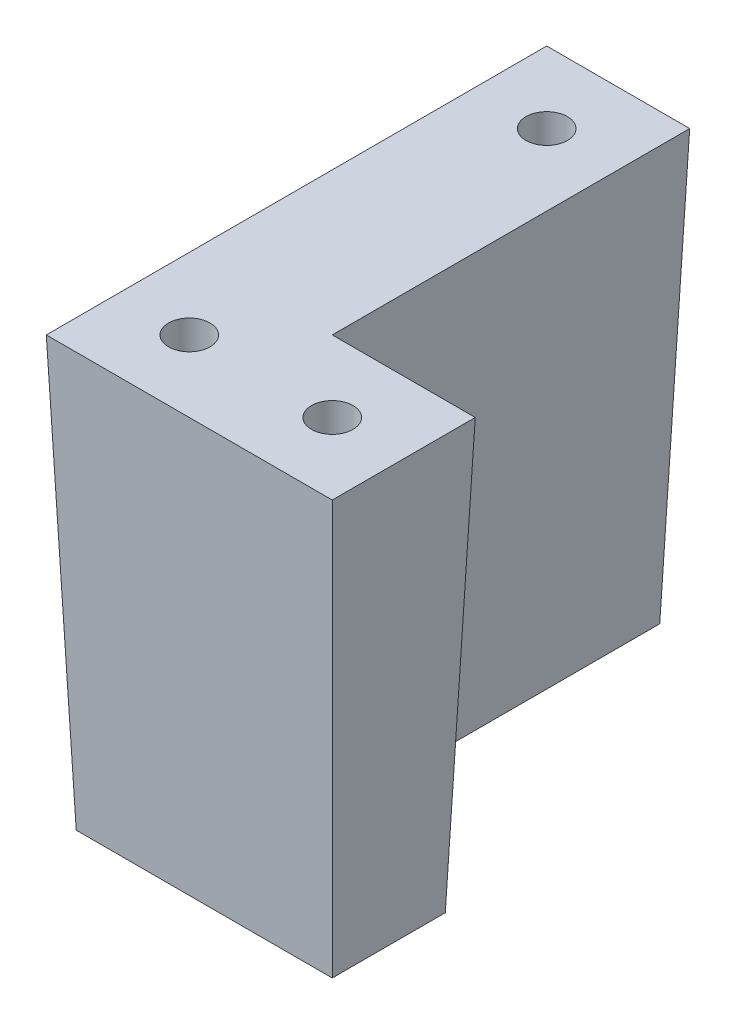
ISO-10303-21;
HEADER;
FILE_DESCRIPTION(('STEP AP214'),'2;1');
FILE_NAME('part.step','',(''),(''),'','','');
FILE_SCHEMA(('AUTOMOTIVE_DESIGN { 1 0 10303 214 1 1 1 1 }'));
ENDSEC;
DATA;
#1=APPLICATION_CONTEXT('core data for automotive mechanical design processes');
#2=APPLICATION_PROTOCOL_DEFINITION('international standard','automotive_design',2000,#1);
#3=PRODUCT_CONTEXT('',#1,'mechanical');
#4=PRODUCT('Part','Part','',(#3));
#5=PRODUCT_RELATED_PRODUCT_CATEGORY('part','',(#4));
#6=PRODUCT_DEFINITION_FORMATION('','',#4);
#7=PRODUCT_DEFINITION_CONTEXT('part definition',#1,'design');
#8=PRODUCT_DEFINITION('design','',#6,#7);
#9=PRODUCT_DEFINITION_SHAPE('','',#8);
#10=(LENGTH_UNIT() NAMED_UNIT(*) SI_UNIT(.MILLI.,.METRE.));
#11=(NAMED_UNIT(*) PLANE_ANGLE_UNIT() SI_UNIT($,.RADIAN.));
#12=(NAMED_UNIT(*) SI_UNIT($,.STERADIAN.) SOLID_ANGLE_UNIT());
#13=UNCERTAINTY_MEASURE_WITH_UNIT(LENGTH_MEASURE(1.E-05),#10,'distance_accuracy_value','');
#14=(GEOMETRIC_REPRESENTATION_CONTEXT(3) GLOBAL_UNCERTAINTY_ASSIGNED_CONTEXT((#13)) GLOBAL_UNIT_ASSIGNED_CONTEXT((#10,
#11,#12)) REPRESENTATION_CONTEXT('',''));
#15=CARTESIAN_POINT('',(0.,0.,0.));
#16=DIRECTION('',(0.,0.,1.));
#17=DIRECTION('',(1.,0.,0.));
#18=AXIS2_PLACEMENT_3D('',#15,#16,#17);
#19=CARTESIAN_POINT('',(0.,0.,0.));
#20=DIRECTION('',(-0.999390827019096,-0.034899496702501,0.));
#21=DIRECTION('',(0.034899496702501,-0.999390827019096,0.));
#22=AXIS2_PLACEMENT_3D('',#19,#20,#21);
#23=PLANE('',#22);
#24=DIRECTION('',(0.,0.,1.));
#25=VECTOR('',#24,1.);
#26=CARTESIAN_POINT('',(0.,0.,0.));
#27=LINE('',#26,#25);
#28=CARTESIAN_POINT('',(0.,0.,-70.));
#29=VERTEX_POINT('',#28);
#30=CARTESIAN_POINT('',(0.,0.,0.));
#31=VERTEX_POINT('',#30);
#32=EDGE_CURVE('E121',#29,#31,#27,.T.);
#33=ORIENTED_EDGE('',*,*,#32,.F.);
#34=DIRECTION('',(-0.0348782627423747,0.998782765958718,-0.0348782627423747));
#35=VECTOR('',#34,1.);
#36=CARTESIAN_POINT('',(0.,0.,-70.));
#37=LINE('',#36,#35);
#38=CARTESIAN_POINT('',(2.09524616950487,-60.,-67.9047538304951));
#39=VERTEX_POINT('',#38);
#40=EDGE_CURVE('E11',#39,#29,#37,.T.);
#41=ORIENTED_EDGE('',*,*,#40,.F.);
#42=DIRECTION('',(0.,0.,1.));
#43=VECTOR('',#42,1.);
#44=CARTESIAN_POINT('',(2.09524616950487,-60.,0.));
#45=LINE('',#44,#43);
#46=CARTESIAN_POINT('',(2.09524616950487,-60.,-2.09524616950487));
#47=VERTEX_POINT('',#46);
#48=EDGE_CURVE('E123',#39,#47,#45,.T.);
#49=ORIENTED_EDGE('',*,*,#48,.T.);
#50=DIRECTION('',(-0.0348782627423747,0.998782765958718,0.0348782627423747));
#51=VECTOR('',#50,1.);
#52=CARTESIAN_POINT('',(0.,0.,0.));
#53=LINE('',#52,#51);
#54=EDGE_CURVE('E94',#47,#31,#53,.T.);
#55=ORIENTED_EDGE('',*,*,#54,.T.);
#56=EDGE_LOOP('',(#33,#41,#49,#55));
#57=FACE_BOUND('',#56,.T.);
#58=ADVANCED_FACE('F43',(#57),#23,.T.);
#59=CARTESIAN_POINT('',(0.,0.,-70.));
#60=DIRECTION('',(0.,-0.034899496702501,-0.999390827019096));
#61=DIRECTION('',(0.,0.999390827019096,-0.034899496702501));
#62=AXIS2_PLACEMENT_3D('',#59,#60,#61);
#63=PLANE('',#62);
#64=DIRECTION('',(-1.,0.,0.));
#65=VECTOR('',#64,1.);
#66=CARTESIAN_POINT('',(0.,0.,-70.));
#67=LINE('',#66,#65);
#68=CARTESIAN_POINT('',(20.,0.,-70.));
#69=VERTEX_POINT('',#68);
#70=EDGE_CURVE('E136',#69,#29,#67,.T.);
#71=ORIENTED_EDGE('',*,*,#70,.F.);
#72=DIRECTION('',(0.0348782627423747,0.998782765958718,-0.0348782627423747));
#73=VECTOR('',#72,1.);
#74=CARTESIAN_POINT('',(20.,0.,-70.));
#75=LINE('',#74,#73);
#76=CARTESIAN_POINT('',(17.9047538304951,-60.,-67.9047538304951));
#77=VERTEX_POINT('',#76);
#78=EDGE_CURVE('E54',#77,#69,#75,.T.);
#79=ORIENTED_EDGE('',*,*,#78,.F.);
#80=DIRECTION('',(-1.,0.,0.));
#81=VECTOR('',#80,1.);
#82=CARTESIAN_POINT('',(0.,-60.,-67.9047538304951));
#83=LINE('',#82,#81);
#84=EDGE_CURVE('E125',#77,#39,#83,.T.);
#85=ORIENTED_EDGE('',*,*,#84,.T.);
#86=ORIENTED_EDGE('',*,*,#40,.T.);
#87=EDGE_LOOP('',(#71,#79,#85,#86));
#88=FACE_BOUND('',#87,.T.);
#89=ADVANCED_FACE('F45',(#88),#63,.T.);
#90=CARTESIAN_POINT('',(20.,0.,-70.));
#91=DIRECTION('',(0.999390827019096,-0.034899496702501,0.));
#92=DIRECTION('',(0.034899496702501,0.999390827019096,0.));
#93=AXIS2_PLACEMENT_3D('',#90,#91,#92);
#94=PLANE('',#93);
#95=DIRECTION('',(0.,0.,-1.));
#96=VECTOR('',#95,1.);
#97=CARTESIAN_POINT('',(20.,0.,-70.));
#98=LINE('',#97,#96);
#99=CARTESIAN_POINT('',(20.,0.,-20.));
#100=VERTEX_POINT('',#99);
#101=EDGE_CURVE('E152',#100,#69,#98,.T.);
#102=ORIENTED_EDGE('',*,*,#101,.F.);
#103=DIRECTION('',(0.0348782627423747,0.998782765958718,-0.0348782627423747));
#104=VECTOR('',#103,1.);
#105=CARTESIAN_POINT('',(20.0608246605963,1.7417903866832,-20.0608246605963));
#106=LINE('',#105,#104);
#107=CARTESIAN_POINT('',(17.9047538304951,-60.,-17.9047538304951));
#108=VERTEX_POINT('',#107);
#109=EDGE_CURVE('E162',#108,#100,#106,.T.);
#110=ORIENTED_EDGE('',*,*,#109,.F.);
#111=DIRECTION('',(0.,0.,-1.));
#112=VECTOR('',#111,1.);
#113=CARTESIAN_POINT('',(17.9047538304951,-60.,-70.));
#114=LINE('',#113,#112);
#115=EDGE_CURVE('E171',#108,#77,#114,.T.);
#116=ORIENTED_EDGE('',*,*,#115,.T.);
#117=ORIENTED_EDGE('',*,*,#78,.T.);
#118=EDGE_LOOP('',(#102,#110,#116,#117));
#119=FACE_BOUND('',#118,.T.);
#120=ADVANCED_FACE('F189',(#119),#94,.T.);
#121=CARTESIAN_POINT('',(40.,0.,-20.));
#122=DIRECTION('',(0.,-0.034899496702501,-0.999390827019096));
#123=DIRECTION('',(0.,0.999390827019096,-0.034899496702501));
#124=AXIS2_PLACEMENT_3D('',#121,#122,#123);
#125=PLANE('',#124);
#126=DIRECTION('',(-1.,0.,0.));
#127=VECTOR('',#126,1.);
#128=CARTESIAN_POINT('',(40.,0.,-20.));
#129=LINE('',#128,#127);
#130=CARTESIAN_POINT('',(40.,0.,-20.));
#131=VERTEX_POINT('',#130);
#132=EDGE_CURVE('E148',#131,#100,#129,.T.);
#133=ORIENTED_EDGE('',*,*,#132,.F.);
#134=DIRECTION('',(0.0348782627423747,0.998782765958718,-0.0348782627423747));
#135=VECTOR('',#134,1.);
#136=CARTESIAN_POINT('',(39.9756701357615,-0.696716154673278,-19.9756701357615));
#137=LINE('',#136,#135);
#138=CARTESIAN_POINT('',(37.9047538304951,-60.,-17.9047538304951));
#139=VERTEX_POINT('',#138);
#140=EDGE_CURVE('E159',#139,#131,#137,.T.);
#141=ORIENTED_EDGE('',*,*,#140,.F.);
#142=DIRECTION('',(-1.,0.,0.));
#143=VECTOR('',#142,1.);
#144=CARTESIAN_POINT('',(40.,-60.,-17.9047538304951));
#145=LINE('',#144,#143);
#146=EDGE_CURVE('E174',#139,#108,#145,.T.);
#147=ORIENTED_EDGE('',*,*,#146,.T.);
#148=ORIENTED_EDGE('',*,*,#109,.T.);
#149=EDGE_LOOP('',(#133,#141,#147,#148));
#150=FACE_BOUND('',#149,.T.);
#151=ADVANCED_FACE('F187',(#150),#125,.T.);
#152=CARTESIAN_POINT('',(40.,0.,0.));
#153=DIRECTION('',(0.999390827019096,-0.034899496702501,0.));
#154=DIRECTION('',(0.034899496702501,0.999390827019096,0.));
#155=AXIS2_PLACEMENT_3D('',#152,#153,#154);
#156=PLANE('',#155);
#157=DIRECTION('',(0.,0.,-1.));
#158=VECTOR('',#157,1.);
#159=CARTESIAN_POINT('',(40.,0.,0.));
#160=LINE('',#159,#158);
#161=CARTESIAN_POINT('',(40.,0.,0.));
#162=VERTEX_POINT('',#161);
#163=EDGE_CURVE('E133',#162,#131,#160,.T.);
#164=ORIENTED_EDGE('',*,*,#163,.F.);
#165=DIRECTION('',(0.0348782627423746,0.998782765958718,0.0348782627423747));
#166=VECTOR('',#165,1.);
#167=CARTESIAN_POINT('',(39.951340271523,-1.39343230934655,-0.0486597284770448));
#168=LINE('',#167,#166);
#169=CARTESIAN_POINT('',(37.9047538304951,-60.,-2.09524616950487));
#170=VERTEX_POINT('',#169);
#171=EDGE_CURVE('E86',#170,#162,#168,.T.);
#172=ORIENTED_EDGE('',*,*,#171,.F.);
#173=DIRECTION('',(0.,0.,-1.));
#174=VECTOR('',#173,1.);
#175=CARTESIAN_POINT('',(37.9047538304951,-60.,0.));
#176=LINE('',#175,#174);
#177=EDGE_CURVE('E177',#170,#139,#176,.T.);
#178=ORIENTED_EDGE('',*,*,#177,.T.);
#179=ORIENTED_EDGE('',*,*,#140,.T.);
#180=EDGE_LOOP('',(#164,#172,#178,#179));
#181=FACE_BOUND('',#180,.T.);
#182=ADVANCED_FACE('F188',(#181),#156,.T.);
#183=CARTESIAN_POINT('',(0.,0.,0.));
#184=DIRECTION('',(0.,-0.034899496702501,0.999390827019096));
#185=DIRECTION('',(0.,-0.999390827019096,-0.034899496702501));
#186=AXIS2_PLACEMENT_3D('',#183,#184,#185);
#187=PLANE('',#186);
#188=DIRECTION('',(1.,0.,0.));
#189=VECTOR('',#188,1.);
#190=CARTESIAN_POINT('',(0.,0.,0.));
#191=LINE('',#190,#189);
#192=EDGE_CURVE('E128',#31,#162,#191,.T.);
#193=ORIENTED_EDGE('',*,*,#192,.F.);
#194=ORIENTED_EDGE('',*,*,#54,.F.);
#195=DIRECTION('',(1.,0.,0.));
#196=VECTOR('',#195,1.);
#197=CARTESIAN_POINT('',(0.,-60.,-2.09524616950487));
#198=LINE('',#197,#196);
#199=EDGE_CURVE('E47',#47,#170,#198,.T.);
#200=ORIENTED_EDGE('',*,*,#199,.T.);
#201=ORIENTED_EDGE('',*,*,#171,.T.);
#202=EDGE_LOOP('',(#193,#194,#200,#201));
#203=FACE_BOUND('',#202,.T.);
#204=ADVANCED_FACE('F129',(#203),#187,.T.);
#205=CARTESIAN_POINT('',(0.,-60.,0.));
#206=DIRECTION('',(0.,-1.,0.));
#207=DIRECTION('',(0.,0.,-1.));
#208=AXIS2_PLACEMENT_3D('',#205,#206,#207);
#209=PLANE('',#208);
#210=CARTESIAN_POINT('',(30.,-60.,-9.99999999996308));
#211=DIRECTION('',(0.,-1.,0.));
#212=DIRECTION('',(0.,0.,-1.));
#213=AXIS2_PLACEMENT_3D('',#210,#211,#212);
#214=CIRCLE('',#213,5.74999999999999);
#215=CARTESIAN_POINT('',(30.,-60.,-15.7499999999631));
#216=VERTEX_POINT('',#215);
#217=EDGE_CURVE('E361',#216,#216,#214,.T.);
#218=ORIENTED_EDGE('',*,*,#217,.F.);
#219=EDGE_LOOP('',(#218));
#220=FACE_BOUND('',#219,.T.);
#221=CARTESIAN_POINT('',(9.99999999999091,-60.,-10.));
#222=DIRECTION('',(0.,-1.,0.));
#223=DIRECTION('',(0.,0.,-1.));
#224=AXIS2_PLACEMENT_3D('',#221,#222,#223);
#225=CIRCLE('',#224,5.74999999999999);
#226=CARTESIAN_POINT('',(9.99999999999091,-60.,-15.75));
#227=VERTEX_POINT('',#226);
#228=EDGE_CURVE('E375',#227,#227,#225,.T.);
#229=ORIENTED_EDGE('',*,*,#228,.F.);
#230=EDGE_LOOP('',(#229));
#231=FACE_BOUND('',#230,.T.);
#232=CARTESIAN_POINT('',(10.0000000007017,-60.,-60.));
#233=DIRECTION('',(0.,-1.,0.));
#234=DIRECTION('',(0.,0.,-1.));
#235=AXIS2_PLACEMENT_3D('',#232,#233,#234);
#236=CIRCLE('',#235,5.74999999999999);
#237=CARTESIAN_POINT('',(10.0000000007017,-60.,-65.75));
#238=VERTEX_POINT('',#237);
#239=EDGE_CURVE('E391',#238,#238,#236,.T.);
#240=ORIENTED_EDGE('',*,*,#239,.F.);
#241=EDGE_LOOP('',(#240));
#242=FACE_BOUND('',#241,.T.);
#243=ORIENTED_EDGE('',*,*,#48,.F.);
#244=ORIENTED_EDGE('',*,*,#84,.F.);
#245=ORIENTED_EDGE('',*,*,#115,.F.);
#246=ORIENTED_EDGE('',*,*,#146,.F.);
#247=ORIENTED_EDGE('',*,*,#177,.F.);
#248=ORIENTED_EDGE('',*,*,#199,.F.);
#249=EDGE_LOOP('',(#243,#244,#245,#246,#247,#248));
#250=FACE_BOUND('',#249,.T.);
#251=ADVANCED_FACE('F181',(#220,#231,#242,#250),#209,.T.);
#252=CARTESIAN_POINT('',(0.,0.,0.));
#253=DIRECTION('',(0.,-1.,0.));
#254=DIRECTION('',(0.,0.,-1.));
#255=AXIS2_PLACEMENT_3D('',#252,#253,#254);
#256=PLANE('',#255);
#257=CARTESIAN_POINT('',(30.,0.,-9.99999999996308));
#258=DIRECTION('',(0.,-1.,0.));
#259=DIRECTION('',(0.,0.,-1.));
#260=AXIS2_PLACEMENT_3D('',#257,#258,#259);
#261=CIRCLE('',#260,2.89999999999998);
#262=CARTESIAN_POINT('',(30.,0.,-12.8999999999631));
#263=VERTEX_POINT('',#262);
#264=EDGE_CURVE('E371',#263,#263,#261,.T.);
#265=ORIENTED_EDGE('',*,*,#264,.T.);
#266=EDGE_LOOP('',(#265));
#267=FACE_BOUND('',#266,.T.);
#268=CARTESIAN_POINT('',(9.99999999999091,0.,-10.));
#269=DIRECTION('',(0.,-1.,0.));
#270=DIRECTION('',(0.,0.,-1.));
#271=AXIS2_PLACEMENT_3D('',#268,#269,#270);
#272=CIRCLE('',#271,2.89999999999998);
#273=CARTESIAN_POINT('',(9.99999999999091,0.,-12.9));
#274=VERTEX_POINT('',#273);
#275=EDGE_CURVE('E387',#274,#274,#272,.T.);
#276=ORIENTED_EDGE('',*,*,#275,.T.);
#277=EDGE_LOOP('',(#276));
#278=FACE_BOUND('',#277,.T.);
#279=CARTESIAN_POINT('',(10.0000000007017,0.,-60.));
#280=DIRECTION('',(0.,-1.,0.));
#281=DIRECTION('',(0.,0.,-1.));
#282=AXIS2_PLACEMENT_3D('',#279,#280,#281);
#283=CIRCLE('',#282,2.89999999999998);
#284=CARTESIAN_POINT('',(10.0000000007017,0.,-62.9));
#285=VERTEX_POINT('',#284);
#286=EDGE_CURVE('E138',#285,#285,#283,.T.);
#287=ORIENTED_EDGE('',*,*,#286,.T.);
#288=EDGE_LOOP('',(#287));
#289=FACE_BOUND('',#288,.T.);
#290=ORIENTED_EDGE('',*,*,#32,.T.);
#291=ORIENTED_EDGE('',*,*,#192,.T.);
#292=ORIENTED_EDGE('',*,*,#163,.T.);
#293=ORIENTED_EDGE('',*,*,#132,.T.);
#294=ORIENTED_EDGE('',*,*,#101,.T.);
#295=ORIENTED_EDGE('',*,*,#70,.T.);
#296=EDGE_LOOP('',(#290,#291,#292,#293,#294,#295));
#297=FACE_BOUND('',#296,.T.);
#298=ADVANCED_FACE('F135',(#267,#278,#289,#297),#256,.F.);
#299=CARTESIAN_POINT('',(10.0000000007017,-60.,-60.));
#300=DIRECTION('',(0.,-1.,0.));
#301=DIRECTION('',(0.,0.,-1.));
#302=AXIS2_PLACEMENT_3D('',#299,#300,#301);
#303=CYLINDRICAL_SURFACE('',#302,2.89999999999998);
#304=ORIENTED_EDGE('',*,*,#286,.F.);
#305=EDGE_LOOP('',(#304));
#306=FACE_BOUND('',#305,.T.);
#307=CARTESIAN_POINT('',(10.0000000007017,-4.99999999999999,-60.));
#308=DIRECTION('',(0.,-1.,0.));
#309=DIRECTION('',(0.,0.,-1.));
#310=AXIS2_PLACEMENT_3D('',#307,#308,#309);
#311=CIRCLE('',#310,2.89999999999999);
#312=CARTESIAN_POINT('',(10.0000000007017,-4.99999999999999,-62.9));
#313=VERTEX_POINT('',#312);
#314=EDGE_CURVE('E142',#313,#313,#311,.T.);
#315=ORIENTED_EDGE('',*,*,#314,.T.);
#316=EDGE_LOOP('',(#315));
#317=FACE_BOUND('',#316,.T.);
#318=ADVANCED_FACE('F224',(#306,#317),#303,.F.);
#319=CARTESIAN_POINT('',(12.9000000007017,-4.99999999999999,-60.));
#320=DIRECTION('',(0.,1.,0.));
#321=DIRECTION('',(0.,0.,1.));
#322=AXIS2_PLACEMENT_3D('',#319,#320,#321);
#323=PLANE('',#322);
#324=ORIENTED_EDGE('',*,*,#314,.F.);
#325=EDGE_LOOP('',(#324));
#326=FACE_BOUND('',#325,.T.);
#327=CARTESIAN_POINT('',(10.0000000007017,-5.,-60.));
#328=DIRECTION('',(0.,-1.,0.));
#329=DIRECTION('',(0.,0.,-1.));
#330=AXIS2_PLACEMENT_3D('',#327,#328,#329);
#331=CIRCLE('',#330,5.74999999999999);
#332=CARTESIAN_POINT('',(10.0000000007017,-5.,-65.75));
#333=VERTEX_POINT('',#332);
#334=EDGE_CURVE('E395',#333,#333,#331,.T.);
#335=ORIENTED_EDGE('',*,*,#334,.T.);
#336=EDGE_LOOP('',(#335));
#337=FACE_BOUND('',#336,.T.);
#338=ADVANCED_FACE('F231',(#326,#337),#323,.F.);
#339=CARTESIAN_POINT('',(10.0000000007017,-60.,-60.));
#340=DIRECTION('',(0.,-1.,0.));
#341=DIRECTION('',(0.,0.,-1.));
#342=AXIS2_PLACEMENT_3D('',#339,#340,#341);
#343=CYLINDRICAL_SURFACE('',#342,5.74999999999999);
#344=ORIENTED_EDGE('',*,*,#334,.F.);
#345=EDGE_LOOP('',(#344));
#346=FACE_BOUND('',#345,.T.);
#347=ORIENTED_EDGE('',*,*,#239,.T.);
#348=EDGE_LOOP('',(#347));
#349=FACE_BOUND('',#348,.T.);
#350=ADVANCED_FACE('F239',(#346,#349),#343,.F.);
#351=CARTESIAN_POINT('',(9.99999999999091,-60.,-10.));
#352=DIRECTION('',(0.,-1.,0.));
#353=DIRECTION('',(0.,0.,-1.));
#354=AXIS2_PLACEMENT_3D('',#351,#352,#353);
#355=CYLINDRICAL_SURFACE('',#354,2.89999999999998);
#356=ORIENTED_EDGE('',*,*,#275,.F.);
#357=EDGE_LOOP('',(#356));
#358=FACE_BOUND('',#357,.T.);
#359=CARTESIAN_POINT('',(9.99999999999091,-4.99999999999999,-10.));
#360=DIRECTION('',(0.,-1.,0.));
#361=DIRECTION('',(0.,0.,-1.));
#362=AXIS2_PLACEMENT_3D('',#359,#360,#361);
#363=CIRCLE('',#362,2.89999999999999);
#364=CARTESIAN_POINT('',(9.99999999999091,-4.99999999999999,-12.9));
#365=VERTEX_POINT('',#364);
#366=EDGE_CURVE('E383',#365,#365,#363,.T.);
#367=ORIENTED_EDGE('',*,*,#366,.T.);
#368=EDGE_LOOP('',(#367));
#369=FACE_BOUND('',#368,.T.);
#370=ADVANCED_FACE('F248',(#358,#369),#355,.F.);
#371=CARTESIAN_POINT('',(12.8999999999909,-4.99999999999999,-10.));
#372=DIRECTION('',(0.,1.,0.));
#373=DIRECTION('',(0.,0.,1.));
#374=AXIS2_PLACEMENT_3D('',#371,#372,#373);
#375=PLANE('',#374);
#376=ORIENTED_EDGE('',*,*,#366,.F.);
#377=EDGE_LOOP('',(#376));
#378=FACE_BOUND('',#377,.T.);
#379=CARTESIAN_POINT('',(9.99999999999091,-5.,-10.));
#380=DIRECTION('',(0.,-1.,0.));
#381=DIRECTION('',(0.,0.,-1.));
#382=AXIS2_PLACEMENT_3D('',#379,#380,#381);
#383=CIRCLE('',#382,5.74999999999998);
#384=CARTESIAN_POINT('',(9.99999999999091,-5.,-15.75));
#385=VERTEX_POINT('',#384);
#386=EDGE_CURVE('E379',#385,#385,#383,.T.);
#387=ORIENTED_EDGE('',*,*,#386,.T.);
#388=EDGE_LOOP('',(#387));
#389=FACE_BOUND('',#388,.T.);
#390=ADVANCED_FACE('F255',(#378,#389),#375,.F.);
#391=CARTESIAN_POINT('',(9.99999999999091,-60.,-10.));
#392=DIRECTION('',(0.,-1.,0.));
#393=DIRECTION('',(0.,0.,-1.));
#394=AXIS2_PLACEMENT_3D('',#391,#392,#393);
#395=CYLINDRICAL_SURFACE('',#394,5.74999999999999);
#396=ORIENTED_EDGE('',*,*,#386,.F.);
#397=EDGE_LOOP('',(#396));
#398=FACE_BOUND('',#397,.T.);
#399=ORIENTED_EDGE('',*,*,#228,.T.);
#400=EDGE_LOOP('',(#399));
#401=FACE_BOUND('',#400,.T.);
#402=ADVANCED_FACE('F263',(#398,#401),#395,.F.);
#403=CARTESIAN_POINT('',(30.,-60.,-9.99999999996308));
#404=DIRECTION('',(0.,-1.,0.));
#405=DIRECTION('',(0.,0.,-1.));
#406=AXIS2_PLACEMENT_3D('',#403,#404,#405);
#407=CYLINDRICAL_SURFACE('',#406,2.89999999999998);
#408=ORIENTED_EDGE('',*,*,#264,.F.);
#409=EDGE_LOOP('',(#408));
#410=FACE_BOUND('',#409,.T.);
#411=CARTESIAN_POINT('',(30.,-4.99999999999999,-9.99999999996308));
#412=DIRECTION('',(0.,-1.,0.));
#413=DIRECTION('',(0.,0.,-1.));
#414=AXIS2_PLACEMENT_3D('',#411,#412,#413);
#415=CIRCLE('',#414,2.89999999999999);
#416=CARTESIAN_POINT('',(30.,-4.99999999999999,-12.8999999999631));
#417=VERTEX_POINT('',#416);
#418=EDGE_CURVE('E365',#417,#417,#415,.T.);
#419=ORIENTED_EDGE('',*,*,#418,.T.);
#420=EDGE_LOOP('',(#419));
#421=FACE_BOUND('',#420,.T.);
#422=ADVANCED_FACE('F271',(#410,#421),#407,.F.);
#423=CARTESIAN_POINT('',(32.9,-4.99999999999999,-9.99999999996308));
#424=DIRECTION('',(0.,1.,0.));
#425=DIRECTION('',(0.,0.,1.));
#426=AXIS2_PLACEMENT_3D('',#423,#424,#425);
#427=PLANE('',#426);
#428=ORIENTED_EDGE('',*,*,#418,.F.);
#429=EDGE_LOOP('',(#428));
#430=FACE_BOUND('',#429,.T.);
#431=CARTESIAN_POINT('',(30.,-5.,-9.99999999996308));
#432=DIRECTION('',(0.,-1.,0.));
#433=DIRECTION('',(0.,0.,-1.));
#434=AXIS2_PLACEMENT_3D('',#431,#432,#433);
#435=CIRCLE('',#434,5.74999999999998);
#436=CARTESIAN_POINT('',(30.,-5.,-15.7499999999631));
#437=VERTEX_POINT('',#436);
#438=EDGE_CURVE('E358',#437,#437,#435,.T.);
#439=ORIENTED_EDGE('',*,*,#438,.T.);
#440=EDGE_LOOP('',(#439));
#441=FACE_BOUND('',#440,.T.);
#442=ADVANCED_FACE('F277',(#430,#441),#427,.F.);
#443=CARTESIAN_POINT('',(30.,-60.,-9.99999999996308));
#444=DIRECTION('',(0.,-1.,0.));
#445=DIRECTION('',(0.,0.,-1.));
#446=AXIS2_PLACEMENT_3D('',#443,#444,#445);
#447=CYLINDRICAL_SURFACE('',#446,5.74999999999999);
#448=ORIENTED_EDGE('',*,*,#438,.F.);
#449=EDGE_LOOP('',(#448));
#450=FACE_BOUND('',#449,.T.);
#451=ORIENTED_EDGE('',*,*,#217,.T.);
#452=EDGE_LOOP('',(#451));
#453=FACE_BOUND('',#452,.T.);
#454=ADVANCED_FACE('F285',(#450,#453),#447,.F.);
#455=CLOSED_SHELL('',(#58,#89,#120,#151,#182,#204,#251,#298,#318,#338,#350,#370,#390,#402,#422,
#442,#454));
#456=MANIFOLD_SOLID_BREP('B2',#455);
#457=ADVANCED_BREP_SHAPE_REPRESENTATION('',(#18,#456),#14);
#458=SHAPE_DEFINITION_REPRESENTATION(#9,#457);
ENDSEC;
END-ISO-10303-21;
